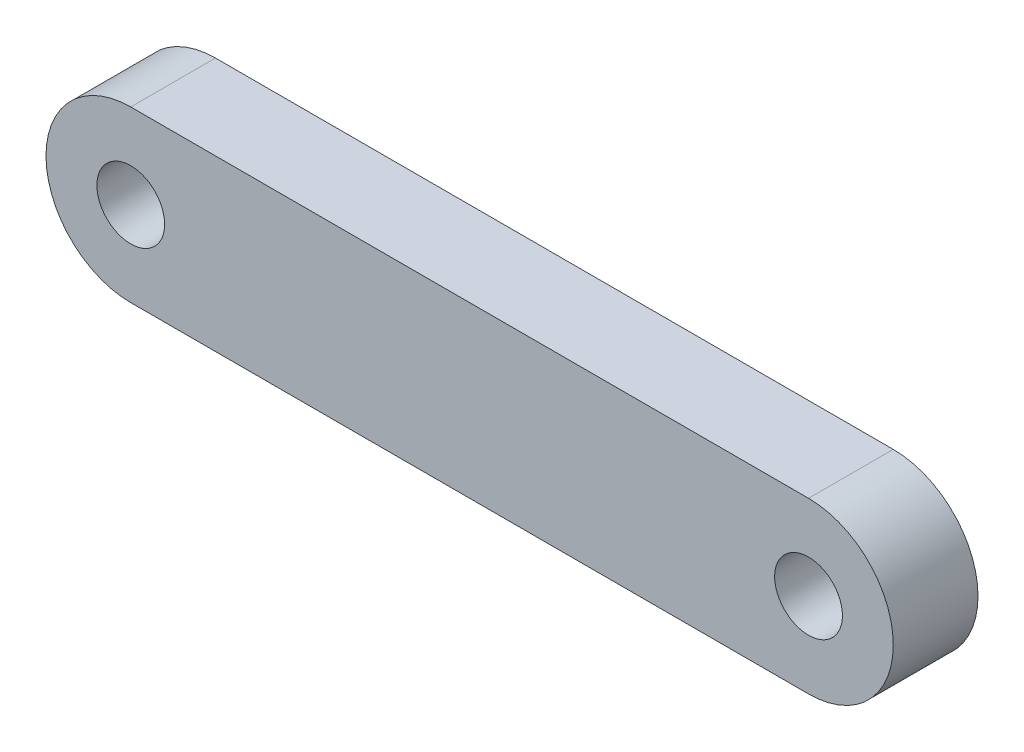
ISO-10303-21;
HEADER;
FILE_DESCRIPTION(('STEP AP214'),'2;1');
FILE_NAME('part.step','',(''),(''),'','','');
FILE_SCHEMA(('AUTOMOTIVE_DESIGN { 1 0 10303 214 1 1 1 1 }'));
ENDSEC;
DATA;
#1=APPLICATION_CONTEXT('core data for automotive mechanical design processes');
#2=APPLICATION_PROTOCOL_DEFINITION('international standard','automotive_design',2000,#1);
#3=PRODUCT_CONTEXT('',#1,'mechanical');
#4=PRODUCT('Part','Part','',(#3));
#5=PRODUCT_RELATED_PRODUCT_CATEGORY('part','',(#4));
#6=PRODUCT_DEFINITION_FORMATION('','',#4);
#7=PRODUCT_DEFINITION_CONTEXT('part definition',#1,'design');
#8=PRODUCT_DEFINITION('design','',#6,#7);
#9=PRODUCT_DEFINITION_SHAPE('','',#8);
#10=(LENGTH_UNIT() NAMED_UNIT(*) SI_UNIT(.MILLI.,.METRE.));
#11=(NAMED_UNIT(*) PLANE_ANGLE_UNIT() SI_UNIT($,.RADIAN.));
#12=(NAMED_UNIT(*) SI_UNIT($,.STERADIAN.) SOLID_ANGLE_UNIT());
#13=UNCERTAINTY_MEASURE_WITH_UNIT(LENGTH_MEASURE(1.E-05),#10,'distance_accuracy_value','');
#14=(GEOMETRIC_REPRESENTATION_CONTEXT(3) GLOBAL_UNCERTAINTY_ASSIGNED_CONTEXT((#13)) GLOBAL_UNIT_ASSIGNED_CONTEXT((#10,
#11,#12)) REPRESENTATION_CONTEXT('',''));
#15=CARTESIAN_POINT('',(0.,0.,0.));
#16=DIRECTION('',(0.,0.,1.));
#17=DIRECTION('',(1.,0.,0.));
#18=AXIS2_PLACEMENT_3D('',#15,#16,#17);
#19=CARTESIAN_POINT('',(-16.7366038095068,-1.81842818428184,5.));
#20=DIRECTION('',(0.,0.,-1.));
#21=DIRECTION('',(-1.,0.,0.));
#22=AXIS2_PLACEMENT_3D('',#19,#20,#21);
#23=CYLINDRICAL_SURFACE('',#22,5.);
#24=CARTESIAN_POINT('',(-16.7366038095068,-1.81842818428184,0.));
#25=DIRECTION('',(0.,0.,1.));
#26=DIRECTION('',(1.,0.,0.));
#27=AXIS2_PLACEMENT_3D('',#24,#25,#26);
#28=CIRCLE('',#27,5.);
#29=CARTESIAN_POINT('',(-16.7366038095068,3.18157181571816,0.));
#30=VERTEX_POINT('',#29);
#31=CARTESIAN_POINT('',(-16.7366038095068,-6.81842818428184,0.));
#32=VERTEX_POINT('',#31);
#33=EDGE_CURVE('E96',#30,#32,#28,.T.);
#34=ORIENTED_EDGE('',*,*,#33,.T.);
#35=DIRECTION('',(0.,0.,-1.));
#36=VECTOR('',#35,1.);
#37=CARTESIAN_POINT('',(-16.7366038095068,-6.81842818428184,5.));
#38=LINE('',#37,#36);
#39=CARTESIAN_POINT('',(-16.7366038095068,-6.81842818428184,5.));
#40=VERTEX_POINT('',#39);
#41=EDGE_CURVE('E11',#40,#32,#38,.T.);
#42=ORIENTED_EDGE('',*,*,#41,.F.);
#43=CARTESIAN_POINT('',(-16.7366038095068,-1.81842818428184,5.));
#44=DIRECTION('',(0.,0.,1.));
#45=DIRECTION('',(1.,0.,0.));
#46=AXIS2_PLACEMENT_3D('',#43,#44,#45);
#47=CIRCLE('',#46,5.);
#48=CARTESIAN_POINT('',(-16.7366038095068,3.18157181571816,5.));
#49=VERTEX_POINT('',#48);
#50=EDGE_CURVE('E84',#49,#40,#47,.T.);
#51=ORIENTED_EDGE('',*,*,#50,.F.);
#52=DIRECTION('',(0.,0.,-1.));
#53=VECTOR('',#52,1.);
#54=CARTESIAN_POINT('',(-16.7366038095068,3.18157181571816,5.));
#55=LINE('',#54,#53);
#56=EDGE_CURVE('E92',#49,#30,#55,.T.);
#57=ORIENTED_EDGE('',*,*,#56,.T.);
#58=EDGE_LOOP('',(#34,#42,#51,#57));
#59=FACE_BOUND('',#58,.T.);
#60=ADVANCED_FACE('F33',(#59),#23,.T.);
#61=CARTESIAN_POINT('',(-16.7366038095068,-6.81842818428184,5.));
#62=DIRECTION('',(0.,1.,0.));
#63=DIRECTION('',(-1.,0.,0.));
#64=AXIS2_PLACEMENT_3D('',#61,#62,#63);
#65=PLANE('',#64);
#66=DIRECTION('',(1.,0.,0.));
#67=VECTOR('',#66,1.);
#68=CARTESIAN_POINT('',(-16.7366038095068,-6.81842818428184,0.));
#69=LINE('',#68,#67);
#70=CARTESIAN_POINT('',(23.2633961904932,-6.81842818428185,0.));
#71=VERTEX_POINT('',#70);
#72=EDGE_CURVE('E88',#32,#71,#69,.T.);
#73=ORIENTED_EDGE('',*,*,#72,.T.);
#74=DIRECTION('',(0.,0.,-1.));
#75=VECTOR('',#74,1.);
#76=CARTESIAN_POINT('',(23.2633961904932,-6.81842818428185,5.));
#77=LINE('',#76,#75);
#78=CARTESIAN_POINT('',(23.2633961904932,-6.81842818428185,5.));
#79=VERTEX_POINT('',#78);
#80=EDGE_CURVE('E41',#79,#71,#77,.T.);
#81=ORIENTED_EDGE('',*,*,#80,.F.);
#82=DIRECTION('',(1.,0.,0.));
#83=VECTOR('',#82,1.);
#84=CARTESIAN_POINT('',(-16.7366038095068,-6.81842818428184,5.));
#85=LINE('',#84,#83);
#86=EDGE_CURVE('E79',#40,#79,#85,.T.);
#87=ORIENTED_EDGE('',*,*,#86,.F.);
#88=ORIENTED_EDGE('',*,*,#41,.T.);
#89=EDGE_LOOP('',(#73,#81,#87,#88));
#90=FACE_BOUND('',#89,.T.);
#91=ADVANCED_FACE('F87',(#90),#65,.F.);
#92=CARTESIAN_POINT('',(23.2633961904932,-1.81842818428184,5.));
#93=DIRECTION('',(0.,0.,-1.));
#94=DIRECTION('',(-1.,0.,0.));
#95=AXIS2_PLACEMENT_3D('',#92,#93,#94);
#96=CYLINDRICAL_SURFACE('',#95,5.);
#97=CARTESIAN_POINT('',(23.2633961904932,-1.81842818428184,0.));
#98=DIRECTION('',(0.,0.,1.));
#99=DIRECTION('',(1.,0.,0.));
#100=AXIS2_PLACEMENT_3D('',#97,#98,#99);
#101=CIRCLE('',#100,5.);
#102=CARTESIAN_POINT('',(23.2633961904932,3.18157181571816,0.));
#103=VERTEX_POINT('',#102);
#104=EDGE_CURVE('E66',#71,#103,#101,.T.);
#105=ORIENTED_EDGE('',*,*,#104,.T.);
#106=DIRECTION('',(0.,0.,-1.));
#107=VECTOR('',#106,1.);
#108=CARTESIAN_POINT('',(23.2633961904932,3.18157181571816,5.));
#109=LINE('',#108,#107);
#110=CARTESIAN_POINT('',(23.2633961904932,3.18157181571816,5.));
#111=VERTEX_POINT('',#110);
#112=EDGE_CURVE('E89',#111,#103,#109,.T.);
#113=ORIENTED_EDGE('',*,*,#112,.F.);
#114=CARTESIAN_POINT('',(23.2633961904932,-1.81842818428184,5.));
#115=DIRECTION('',(0.,0.,1.));
#116=DIRECTION('',(1.,0.,0.));
#117=AXIS2_PLACEMENT_3D('',#114,#115,#116);
#118=CIRCLE('',#117,5.);
#119=EDGE_CURVE('E82',#79,#111,#118,.T.);
#120=ORIENTED_EDGE('',*,*,#119,.F.);
#121=ORIENTED_EDGE('',*,*,#80,.T.);
#122=EDGE_LOOP('',(#105,#113,#120,#121));
#123=FACE_BOUND('',#122,.T.);
#124=ADVANCED_FACE('F90',(#123),#96,.T.);
#125=CARTESIAN_POINT('',(-16.7366038095068,3.18157181571816,5.));
#126=DIRECTION('',(0.,-1.,0.));
#127=DIRECTION('',(0.,0.,-1.));
#128=AXIS2_PLACEMENT_3D('',#125,#126,#127);
#129=PLANE('',#128);
#130=DIRECTION('',(-1.,0.,0.));
#131=VECTOR('',#130,1.);
#132=CARTESIAN_POINT('',(-16.7366038095068,3.18157181571816,0.));
#133=LINE('',#132,#131);
#134=EDGE_CURVE('E72',#103,#30,#133,.T.);
#135=ORIENTED_EDGE('',*,*,#134,.T.);
#136=ORIENTED_EDGE('',*,*,#56,.F.);
#137=DIRECTION('',(-1.,0.,0.));
#138=VECTOR('',#137,1.);
#139=CARTESIAN_POINT('',(-16.7366038095068,3.18157181571816,5.));
#140=LINE('',#139,#138);
#141=EDGE_CURVE('E49',#111,#49,#140,.T.);
#142=ORIENTED_EDGE('',*,*,#141,.F.);
#143=ORIENTED_EDGE('',*,*,#112,.T.);
#144=EDGE_LOOP('',(#135,#136,#142,#143));
#145=FACE_BOUND('',#144,.T.);
#146=ADVANCED_FACE('F104',(#145),#129,.F.);
#147=CARTESIAN_POINT('',(-16.7366038095068,-1.81842818428184,5.));
#148=DIRECTION('',(0.,0.,1.));
#149=DIRECTION('',(1.,0.,0.));
#150=AXIS2_PLACEMENT_3D('',#147,#148,#149);
#151=PLANE('',#150);
#152=CARTESIAN_POINT('',(-16.7366038095068,-1.81842818428184,5.));
#153=DIRECTION('',(0.,0.,1.));
#154=DIRECTION('',(1.,0.,0.));
#155=AXIS2_PLACEMENT_3D('',#152,#153,#154);
#156=CIRCLE('',#155,2.);
#157=CARTESIAN_POINT('',(-14.7366038095068,-1.81842818428184,5.));
#158=VERTEX_POINT('',#157);
#159=EDGE_CURVE('E116',#158,#158,#156,.T.);
#160=ORIENTED_EDGE('',*,*,#159,.F.);
#161=EDGE_LOOP('',(#160));
#162=FACE_BOUND('',#161,.T.);
#163=CARTESIAN_POINT('',(23.2633961904932,-1.81842818428184,5.));
#164=DIRECTION('',(0.,0.,1.));
#165=DIRECTION('',(1.,0.,0.));
#166=AXIS2_PLACEMENT_3D('',#163,#164,#165);
#167=CIRCLE('',#166,2.);
#168=CARTESIAN_POINT('',(25.2633961904932,-1.81842818428184,5.));
#169=VERTEX_POINT('',#168);
#170=EDGE_CURVE('E110',#169,#169,#167,.T.);
#171=ORIENTED_EDGE('',*,*,#170,.F.);
#172=EDGE_LOOP('',(#171));
#173=FACE_BOUND('',#172,.T.);
#174=ORIENTED_EDGE('',*,*,#50,.T.);
#175=ORIENTED_EDGE('',*,*,#86,.T.);
#176=ORIENTED_EDGE('',*,*,#119,.T.);
#177=ORIENTED_EDGE('',*,*,#141,.T.);
#178=EDGE_LOOP('',(#174,#175,#176,#177));
#179=FACE_BOUND('',#178,.T.);
#180=ADVANCED_FACE('F80',(#162,#173,#179),#151,.T.);
#181=CARTESIAN_POINT('',(-16.7366038095068,-1.81842818428184,0.));
#182=DIRECTION('',(0.,0.,1.));
#183=DIRECTION('',(1.,0.,0.));
#184=AXIS2_PLACEMENT_3D('',#181,#182,#183);
#185=PLANE('',#184);
#186=CARTESIAN_POINT('',(-16.7366038095068,-1.81842818428184,0.));
#187=DIRECTION('',(0.,0.,1.));
#188=DIRECTION('',(1.,0.,0.));
#189=AXIS2_PLACEMENT_3D('',#186,#187,#188);
#190=CIRCLE('',#189,2.);
#191=CARTESIAN_POINT('',(-14.7366038095068,-1.81842818428184,0.));
#192=VERTEX_POINT('',#191);
#193=EDGE_CURVE('E99',#192,#192,#190,.T.);
#194=ORIENTED_EDGE('',*,*,#193,.T.);
#195=EDGE_LOOP('',(#194));
#196=FACE_BOUND('',#195,.T.);
#197=CARTESIAN_POINT('',(23.2633961904932,-1.81842818428184,0.));
#198=DIRECTION('',(0.,0.,1.));
#199=DIRECTION('',(1.,0.,0.));
#200=AXIS2_PLACEMENT_3D('',#197,#198,#199);
#201=CIRCLE('',#200,2.);
#202=CARTESIAN_POINT('',(25.2633961904932,-1.81842818428184,0.));
#203=VERTEX_POINT('',#202);
#204=EDGE_CURVE('E113',#203,#203,#201,.T.);
#205=ORIENTED_EDGE('',*,*,#204,.T.);
#206=EDGE_LOOP('',(#205));
#207=FACE_BOUND('',#206,.T.);
#208=ORIENTED_EDGE('',*,*,#33,.F.);
#209=ORIENTED_EDGE('',*,*,#134,.F.);
#210=ORIENTED_EDGE('',*,*,#104,.F.);
#211=ORIENTED_EDGE('',*,*,#72,.F.);
#212=EDGE_LOOP('',(#208,#209,#210,#211));
#213=FACE_BOUND('',#212,.T.);
#214=ADVANCED_FACE('F107',(#196,#207,#213),#185,.F.);
#215=CARTESIAN_POINT('',(23.2633961904932,-1.81842818428184,0.));
#216=DIRECTION('',(0.,0.,1.));
#217=DIRECTION('',(1.,0.,0.));
#218=AXIS2_PLACEMENT_3D('',#215,#216,#217);
#219=CYLINDRICAL_SURFACE('',#218,2.);
#220=ORIENTED_EDGE('',*,*,#204,.F.);
#221=EDGE_LOOP('',(#220));
#222=FACE_BOUND('',#221,.T.);
#223=ORIENTED_EDGE('',*,*,#170,.T.);
#224=EDGE_LOOP('',(#223));
#225=FACE_BOUND('',#224,.T.);
#226=ADVANCED_FACE('F127',(#222,#225),#219,.F.);
#227=CARTESIAN_POINT('',(-16.7366038095068,-1.81842818428184,0.));
#228=DIRECTION('',(0.,0.,1.));
#229=DIRECTION('',(1.,0.,0.));
#230=AXIS2_PLACEMENT_3D('',#227,#228,#229);
#231=CYLINDRICAL_SURFACE('',#230,2.);
#232=ORIENTED_EDGE('',*,*,#193,.F.);
#233=EDGE_LOOP('',(#232));
#234=FACE_BOUND('',#233,.T.);
#235=ORIENTED_EDGE('',*,*,#159,.T.);
#236=EDGE_LOOP('',(#235));
#237=FACE_BOUND('',#236,.T.);
#238=ADVANCED_FACE('F124',(#234,#237),#231,.F.);
#239=CLOSED_SHELL('',(#60,#91,#124,#146,#180,#214,#226,#238));
#240=MANIFOLD_SOLID_BREP('B2',#239);
#241=ADVANCED_BREP_SHAPE_REPRESENTATION('',(#18,#240),#14);
#242=SHAPE_DEFINITION_REPRESENTATION(#9,#241);
ENDSEC;
END-ISO-10303-21;
